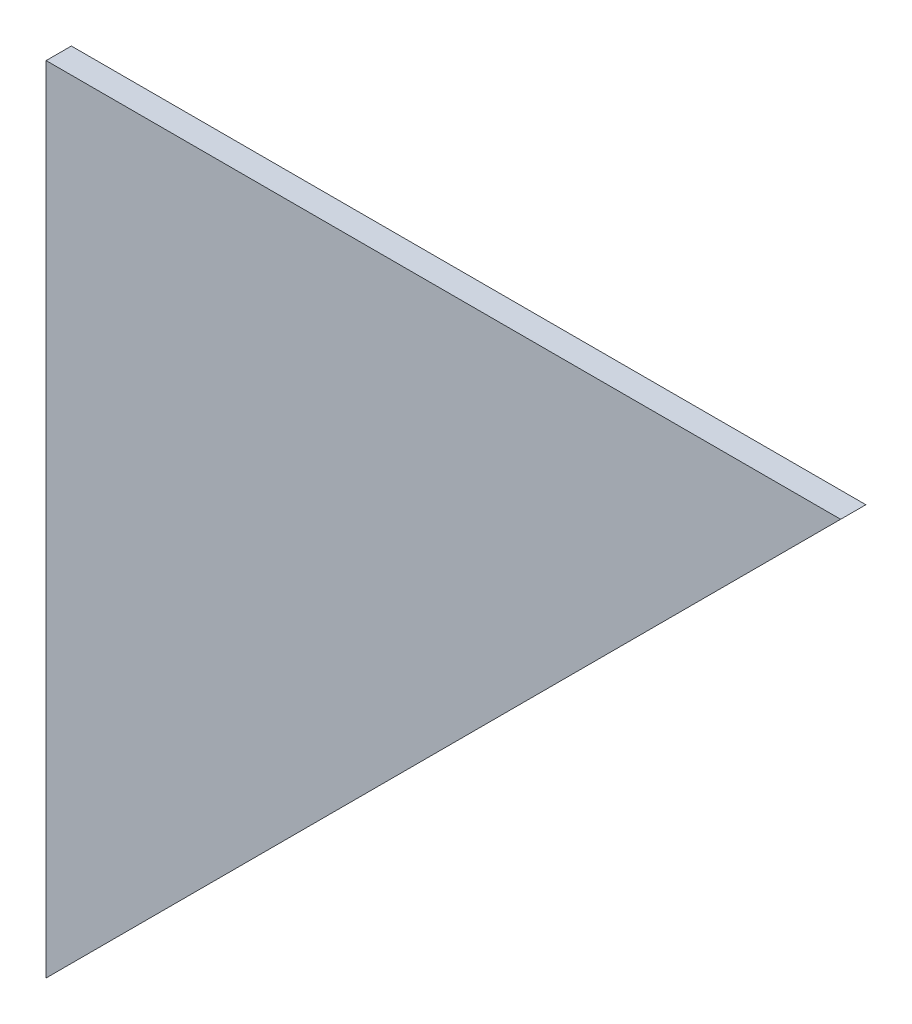
ISO-10303-21;
HEADER;
FILE_DESCRIPTION(('STEP AP214'),'2;1');
FILE_NAME('part.step','',(''),(''),'','','');
FILE_SCHEMA(('AUTOMOTIVE_DESIGN { 1 0 10303 214 1 1 1 1 }'));
ENDSEC;
DATA;
#1=APPLICATION_CONTEXT('core data for automotive mechanical design processes');
#2=APPLICATION_PROTOCOL_DEFINITION('international standard','automotive_design',2000,#1);
#3=PRODUCT_CONTEXT('',#1,'mechanical');
#4=PRODUCT('Part','Part','',(#3));
#5=PRODUCT_RELATED_PRODUCT_CATEGORY('part','',(#4));
#6=PRODUCT_DEFINITION_FORMATION('','',#4);
#7=PRODUCT_DEFINITION_CONTEXT('part definition',#1,'design');
#8=PRODUCT_DEFINITION('design','',#6,#7);
#9=PRODUCT_DEFINITION_SHAPE('','',#8);
#10=(LENGTH_UNIT() NAMED_UNIT(*) SI_UNIT(.MILLI.,.METRE.));
#11=(NAMED_UNIT(*) PLANE_ANGLE_UNIT() SI_UNIT($,.RADIAN.));
#12=(NAMED_UNIT(*) SI_UNIT($,.STERADIAN.) SOLID_ANGLE_UNIT());
#13=UNCERTAINTY_MEASURE_WITH_UNIT(LENGTH_MEASURE(1.E-05),#10,'distance_accuracy_value','');
#14=(GEOMETRIC_REPRESENTATION_CONTEXT(3) GLOBAL_UNCERTAINTY_ASSIGNED_CONTEXT((#13)) GLOBAL_UNIT_ASSIGNED_CONTEXT((#10,
#11,#12)) REPRESENTATION_CONTEXT('',''));
#15=CARTESIAN_POINT('',(0.,0.,0.));
#16=DIRECTION('',(0.,0.,1.));
#17=DIRECTION('',(1.,0.,0.));
#18=AXIS2_PLACEMENT_3D('',#15,#16,#17);
#19=CARTESIAN_POINT('',(41.878921356237,40.383578643763,1.1723000001));
#20=DIRECTION('',(0.,0.,1.));
#21=DIRECTION('',(1.,0.,0.));
#22=AXIS2_PLACEMENT_3D('',#19,#20,#21);
#23=PLANE('',#22);
#24=DIRECTION('',(-1.,0.,0.));
#25=VECTOR('',#24,1.);
#26=CARTESIAN_POINT('',(41.7375,40.525,1.1723000001));
#27=LINE('',#26,#25);
#28=CARTESIAN_POINT('',(42.1375,40.525,1.1723000001));
#29=VERTEX_POINT('',#28);
#30=CARTESIAN_POINT('',(41.7375,40.525,1.1723000001));
#31=VERTEX_POINT('',#30);
#32=EDGE_CURVE('E11',#29,#31,#27,.T.);
#33=ORIENTED_EDGE('',*,*,#32,.T.);
#34=DIRECTION('',(0.,-1.,0.));
#35=VECTOR('',#34,1.);
#36=CARTESIAN_POINT('',(41.7375,40.125,1.1723000001));
#37=LINE('',#36,#35);
#38=CARTESIAN_POINT('',(41.7375,40.125,1.1723000001));
#39=VERTEX_POINT('',#38);
#40=EDGE_CURVE('E27',#31,#39,#37,.T.);
#41=ORIENTED_EDGE('',*,*,#40,.T.);
#42=DIRECTION('',(0.707106781186548,0.707106781186548,0.));
#43=VECTOR('',#42,1.);
#44=CARTESIAN_POINT('',(42.1375,40.525,1.1723000001));
#45=LINE('',#44,#43);
#46=EDGE_CURVE('E65',#39,#29,#45,.T.);
#47=ORIENTED_EDGE('',*,*,#46,.T.);
#48=EDGE_LOOP('',(#33,#41,#47));
#49=FACE_BOUND('',#48,.T.);
#50=ADVANCED_FACE('F17',(#49),#23,.T.);
#51=CARTESIAN_POINT('',(41.7375,40.525,1.1596000001));
#52=DIRECTION('',(0.,-1.,0.));
#53=DIRECTION('',(0.,0.,-1.));
#54=AXIS2_PLACEMENT_3D('',#51,#52,#53);
#55=PLANE('',#54);
#56=DIRECTION('',(0.,0.,-1.));
#57=VECTOR('',#56,1.);
#58=CARTESIAN_POINT('',(42.1375,40.525,1.1596000001));
#59=LINE('',#58,#57);
#60=CARTESIAN_POINT('',(42.1375,40.525,1.1596000001));
#61=VERTEX_POINT('',#60);
#62=EDGE_CURVE('E70',#29,#61,#59,.T.);
#63=ORIENTED_EDGE('',*,*,#62,.T.);
#64=DIRECTION('',(-1.,0.,0.));
#65=VECTOR('',#64,1.);
#66=CARTESIAN_POINT('',(41.878921356237,40.525,1.1596000001));
#67=LINE('',#66,#65);
#68=CARTESIAN_POINT('',(41.7375,40.525,1.1596000001));
#69=VERTEX_POINT('',#68);
#70=EDGE_CURVE('E67',#61,#69,#67,.T.);
#71=ORIENTED_EDGE('',*,*,#70,.T.);
#72=DIRECTION('',(0.,0.,1.));
#73=VECTOR('',#72,1.);
#74=CARTESIAN_POINT('',(41.7375,40.525,1.1596000001));
#75=LINE('',#74,#73);
#76=EDGE_CURVE('E20',#69,#31,#75,.T.);
#77=ORIENTED_EDGE('',*,*,#76,.T.);
#78=ORIENTED_EDGE('',*,*,#32,.F.);
#79=EDGE_LOOP('',(#63,#71,#77,#78));
#80=FACE_BOUND('',#79,.T.);
#81=ADVANCED_FACE('F68',(#80),#55,.F.);
#82=CARTESIAN_POINT('',(41.7375,40.125,1.1596000001));
#83=DIRECTION('',(1.,0.,0.));
#84=DIRECTION('',(0.,1.,0.));
#85=AXIS2_PLACEMENT_3D('',#82,#83,#84);
#86=PLANE('',#85);
#87=ORIENTED_EDGE('',*,*,#76,.F.);
#88=DIRECTION('',(0.,-1.,0.));
#89=VECTOR('',#88,1.);
#90=CARTESIAN_POINT('',(41.7375,40.383578643763,1.1596000001));
#91=LINE('',#90,#89);
#92=CARTESIAN_POINT('',(41.7375,40.125,1.1596000001));
#93=VERTEX_POINT('',#92);
#94=EDGE_CURVE('E62',#69,#93,#91,.T.);
#95=ORIENTED_EDGE('',*,*,#94,.T.);
#96=DIRECTION('',(0.,0.,1.));
#97=VECTOR('',#96,1.);
#98=CARTESIAN_POINT('',(41.7375,40.125,1.1596000001));
#99=LINE('',#98,#97);
#100=EDGE_CURVE('E83',#93,#39,#99,.T.);
#101=ORIENTED_EDGE('',*,*,#100,.T.);
#102=ORIENTED_EDGE('',*,*,#40,.F.);
#103=EDGE_LOOP('',(#87,#95,#101,#102));
#104=FACE_BOUND('',#103,.T.);
#105=ADVANCED_FACE('F59',(#104),#86,.F.);
#106=CARTESIAN_POINT('',(42.1375,40.525,1.1596000001));
#107=DIRECTION('',(-0.707106781186548,0.707106781186548,0.));
#108=DIRECTION('',(0.,0.,1.));
#109=AXIS2_PLACEMENT_3D('',#106,#107,#108);
#110=PLANE('',#109);
#111=ORIENTED_EDGE('',*,*,#100,.F.);
#112=DIRECTION('',(0.707106781186548,0.707106781186548,0.));
#113=VECTOR('',#112,1.);
#114=CARTESIAN_POINT('',(41.7375,40.125,1.1596000001));
#115=LINE('',#114,#113);
#116=EDGE_CURVE('E75',#93,#61,#115,.T.);
#117=ORIENTED_EDGE('',*,*,#116,.T.);
#118=ORIENTED_EDGE('',*,*,#62,.F.);
#119=ORIENTED_EDGE('',*,*,#46,.F.);
#120=EDGE_LOOP('',(#111,#117,#118,#119));
#121=FACE_BOUND('',#120,.T.);
#122=ADVANCED_FACE('F97',(#121),#110,.F.);
#123=CARTESIAN_POINT('',(41.878921356237,40.383578643763,1.1596000001));
#124=DIRECTION('',(0.,0.,1.));
#125=DIRECTION('',(1.,0.,0.));
#126=AXIS2_PLACEMENT_3D('',#123,#124,#125);
#127=PLANE('',#126);
#128=ORIENTED_EDGE('',*,*,#94,.F.);
#129=ORIENTED_EDGE('',*,*,#70,.F.);
#130=ORIENTED_EDGE('',*,*,#116,.F.);
#131=EDGE_LOOP('',(#128,#129,#130));
#132=FACE_BOUND('',#131,.T.);
#133=ADVANCED_FACE('F77',(#132),#127,.F.);
#134=CLOSED_SHELL('',(#50,#81,#105,#122,#133));
#135=MANIFOLD_SOLID_BREP('B1',#134);
#136=ADVANCED_BREP_SHAPE_REPRESENTATION('',(#18,#135),#14);
#137=SHAPE_DEFINITION_REPRESENTATION(#9,#136);
ENDSEC;
END-ISO-10303-21;
